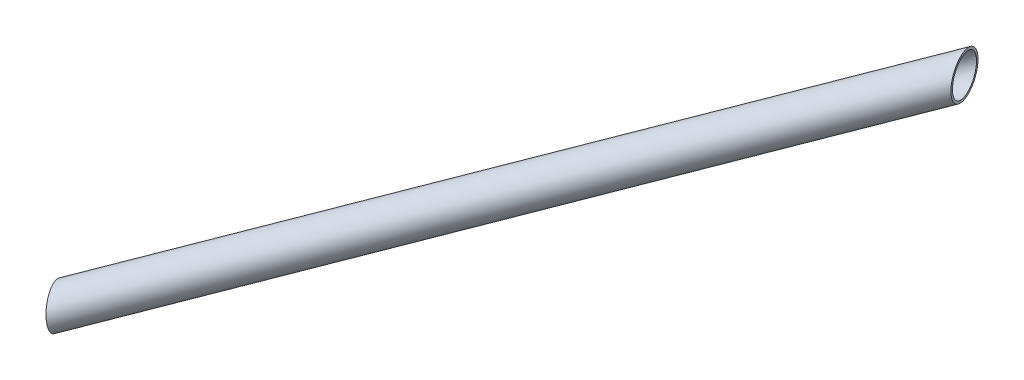
ISO-10303-21;
HEADER;
FILE_DESCRIPTION(('STEP AP214'),'2;1');
FILE_NAME('part.step','',(''),(''),'','','');
FILE_SCHEMA(('AUTOMOTIVE_DESIGN { 1 0 10303 214 1 1 1 1 }'));
ENDSEC;
DATA;
#1=APPLICATION_CONTEXT('core data for automotive mechanical design processes');
#2=APPLICATION_PROTOCOL_DEFINITION('international standard','automotive_design',2000,#1);
#3=PRODUCT_CONTEXT('',#1,'mechanical');
#4=PRODUCT('Part','Part','',(#3));
#5=PRODUCT_RELATED_PRODUCT_CATEGORY('part','',(#4));
#6=PRODUCT_DEFINITION_FORMATION('','',#4);
#7=PRODUCT_DEFINITION_CONTEXT('part definition',#1,'design');
#8=PRODUCT_DEFINITION('design','',#6,#7);
#9=PRODUCT_DEFINITION_SHAPE('','',#8);
#10=(LENGTH_UNIT() NAMED_UNIT(*) SI_UNIT(.MILLI.,.METRE.));
#11=(NAMED_UNIT(*) PLANE_ANGLE_UNIT() SI_UNIT($,.RADIAN.));
#12=(NAMED_UNIT(*) SI_UNIT($,.STERADIAN.) SOLID_ANGLE_UNIT());
#13=UNCERTAINTY_MEASURE_WITH_UNIT(LENGTH_MEASURE(1.E-05),#10,'distance_accuracy_value','');
#14=(GEOMETRIC_REPRESENTATION_CONTEXT(3) GLOBAL_UNCERTAINTY_ASSIGNED_CONTEXT((#13)) GLOBAL_UNIT_ASSIGNED_CONTEXT((#10,
#11,#12)) REPRESENTATION_CONTEXT('',''));
#15=CARTESIAN_POINT('',(0.,0.,0.));
#16=DIRECTION('',(0.,0.,1.));
#17=DIRECTION('',(1.,0.,0.));
#18=AXIS2_PLACEMENT_3D('',#15,#16,#17);
#19=CARTESIAN_POINT('',(50.0000000000001,130.,0.));
#20=DIRECTION('',(0.636784790371593,0.254713916148637,-0.727754046138963));
#21=DIRECTION('',(-0.752576694706878,0.,-0.658504607868518));
#22=AXIS2_PLACEMENT_3D('',#19,#20,#21);
#23=CYLINDRICAL_SURFACE('',#22,7.1);
#24=CARTESIAN_POINT('',(231.007861745532,202.403144698213,-206.86612770918));
#25=DIRECTION('',(0.946820221432302,0.0572844625639429,-0.316622738658561));
#26=DIRECTION('',(-0.313257210262409,0.388871019636094,-0.866400167535647));
#27=AXIS2_PLACEMENT_3D('',#24,#25,#26);
#28=ELLIPSE('',#27,8.37327992091091,7.1);
#29=CARTESIAN_POINT('',(228.384871436762,205.659270598756,-214.12073883548));
#30=VERTEX_POINT('',#29);
#31=EDGE_CURVE('E53',#30,#30,#28,.T.);
#32=ORIENTED_EDGE('',*,*,#31,.T.);
#33=EDGE_LOOP('',(#32));
#34=FACE_BOUND('',#33,.T.);
#35=CARTESIAN_POINT('',(50.,130.,0.));
#36=DIRECTION('',(-0.904650427063292,-0.140780299510552,0.402229427173004));
#37=DIRECTION('',(-0.426154437750217,0.298851652810821,-0.853861865173774));
#38=AXIS2_PLACEMENT_3D('',#35,#36,#37);
#39=ELLIPSE('',#38,7.84833543167416,7.1);
#40=CARTESIAN_POINT('',(46.6553970268398,132.34548801557,-6.70139433019862));
#41=VERTEX_POINT('',#40);
#42=EDGE_CURVE('E43',#41,#41,#39,.T.);
#43=ORIENTED_EDGE('',*,*,#42,.T.);
#44=EDGE_LOOP('',(#43));
#45=FACE_BOUND('',#44,.T.);
#46=ADVANCED_FACE('F39',(#34,#45),#23,.F.);
#47=CARTESIAN_POINT('',(50.0000000000001,130.,0.));
#48=DIRECTION('',(0.636784790371593,0.254713916148637,-0.727754046138963));
#49=DIRECTION('',(-0.752576694706878,0.,-0.658504607868518));
#50=AXIS2_PLACEMENT_3D('',#47,#48,#49);
#51=CYLINDRICAL_SURFACE('',#50,8.);
#52=CARTESIAN_POINT('',(231.007861745532,202.403144698213,-206.86612770918));
#53=DIRECTION('',(0.946820221432302,0.0572844625639429,-0.316622738658561));
#54=DIRECTION('',(-0.313257210262409,0.388871019636094,-0.866400167535647));
#55=AXIS2_PLACEMENT_3D('',#52,#53,#54);
#56=ELLIPSE('',#55,9.43468160102638,8.);
#57=CARTESIAN_POINT('',(228.052379707481,206.072018952346,-215.040337428954));
#58=VERTEX_POINT('',#57);
#59=EDGE_CURVE('E47',#58,#58,#56,.T.);
#60=ORIENTED_EDGE('',*,*,#59,.F.);
#61=EDGE_LOOP('',(#60));
#62=FACE_BOUND('',#61,.T.);
#63=CARTESIAN_POINT('',(50.,130.,0.));
#64=DIRECTION('',(-0.904650427063292,-0.140780299510552,0.402229427173004));
#65=DIRECTION('',(-0.426154437750217,0.298851652810821,-0.853861865173774));
#66=AXIS2_PLACEMENT_3D('',#63,#64,#65);
#67=ELLIPSE('',#66,8.84319485259062,8.);
#68=CARTESIAN_POINT('',(46.2314332696787,132.642803397825,-7.55086685092804));
#69=VERTEX_POINT('',#68);
#70=EDGE_CURVE('E10',#69,#69,#67,.T.);
#71=ORIENTED_EDGE('',*,*,#70,.F.);
#72=EDGE_LOOP('',(#71));
#73=FACE_BOUND('',#72,.T.);
#74=ADVANCED_FACE('F67',(#62,#73),#51,.T.);
#75=CARTESIAN_POINT('',(233.162514885535,207.814352134855,-199.443896182432));
#76=DIRECTION('',(0.946820221432302,0.0572844625639429,-0.316622738658561));
#77=DIRECTION('',(-0.317143521010224,0.,-0.948377555133628));
#78=AXIS2_PLACEMENT_3D('',#75,#76,#77);
#79=PLANE('',#78);
#80=ORIENTED_EDGE('',*,*,#31,.F.);
#81=EDGE_LOOP('',(#80));
#82=FACE_BOUND('',#81,.T.);
#83=ORIENTED_EDGE('',*,*,#59,.T.);
#84=EDGE_LOOP('',(#83));
#85=FACE_BOUND('',#84,.T.);
#86=ADVANCED_FACE('F62',(#82,#85),#79,.T.);
#87=CARTESIAN_POINT('',(50.,130.,0.));
#88=DIRECTION('',(-0.904650427063292,-0.140780299510552,0.402229427173004));
#89=DIRECTION('',(0.406275581998161,0.,0.913750595880547));
#90=AXIS2_PLACEMENT_3D('',#87,#88,#89);
#91=PLANE('',#90);
#92=ORIENTED_EDGE('',*,*,#42,.F.);
#93=EDGE_LOOP('',(#92));
#94=FACE_BOUND('',#93,.T.);
#95=ORIENTED_EDGE('',*,*,#70,.T.);
#96=EDGE_LOOP('',(#95));
#97=FACE_BOUND('',#96,.T.);
#98=ADVANCED_FACE('F41',(#94,#97),#91,.T.);
#99=CLOSED_SHELL('',(#46,#74,#86,#98));
#100=MANIFOLD_SOLID_BREP('B2',#99);
#101=ADVANCED_BREP_SHAPE_REPRESENTATION('',(#18,#100),#14);
#102=SHAPE_DEFINITION_REPRESENTATION(#9,#101);
ENDSEC;
END-ISO-10303-21;
